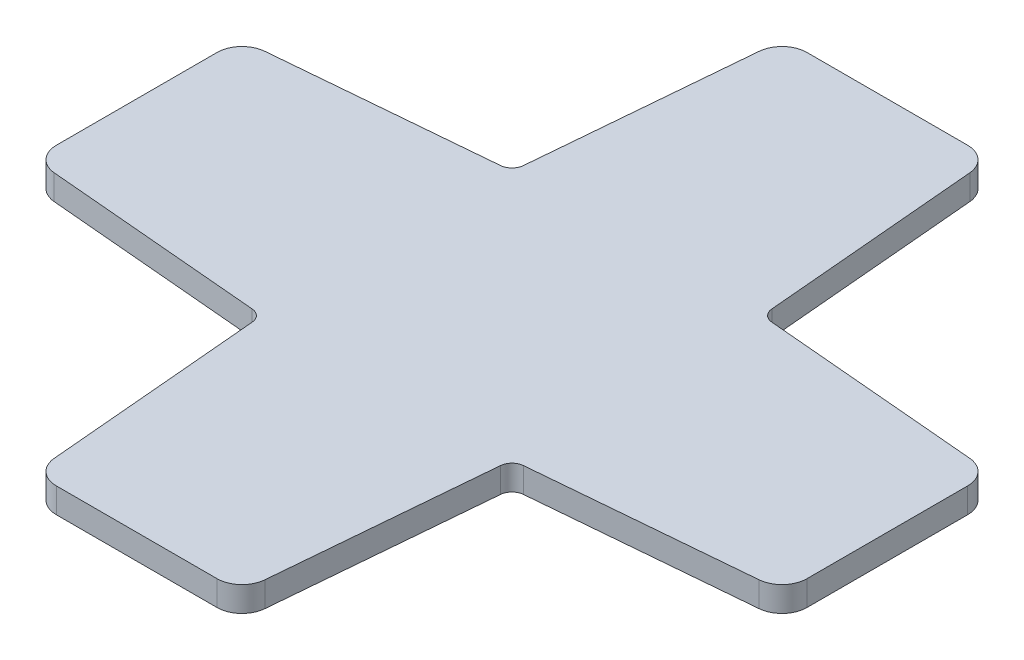
ISO-10303-21;
HEADER;
FILE_DESCRIPTION(('STEP AP214'),'2;1');
FILE_NAME('part.step','',(''),(''),'','','');
FILE_SCHEMA(('AUTOMOTIVE_DESIGN { 1 0 10303 214 1 1 1 1 }'));
ENDSEC;
DATA;
#1=APPLICATION_CONTEXT('core data for automotive mechanical design processes');
#2=APPLICATION_PROTOCOL_DEFINITION('international standard','automotive_design',2000,#1);
#3=PRODUCT_CONTEXT('',#1,'mechanical');
#4=PRODUCT('Part','Part','',(#3));
#5=PRODUCT_RELATED_PRODUCT_CATEGORY('part','',(#4));
#6=PRODUCT_DEFINITION_FORMATION('','',#4);
#7=PRODUCT_DEFINITION_CONTEXT('part definition',#1,'design');
#8=PRODUCT_DEFINITION('design','',#6,#7);
#9=PRODUCT_DEFINITION_SHAPE('','',#8);
#10=(LENGTH_UNIT() NAMED_UNIT(*) SI_UNIT(.MILLI.,.METRE.));
#11=(NAMED_UNIT(*) PLANE_ANGLE_UNIT() SI_UNIT($,.RADIAN.));
#12=(NAMED_UNIT(*) SI_UNIT($,.STERADIAN.) SOLID_ANGLE_UNIT());
#13=UNCERTAINTY_MEASURE_WITH_UNIT(LENGTH_MEASURE(1.E-05),#10,'distance_accuracy_value','');
#14=(GEOMETRIC_REPRESENTATION_CONTEXT(3) GLOBAL_UNCERTAINTY_ASSIGNED_CONTEXT((#13)) GLOBAL_UNIT_ASSIGNED_CONTEXT((#10,
#11,#12)) REPRESENTATION_CONTEXT('',''));
#15=CARTESIAN_POINT('',(0.,0.,0.));
#16=DIRECTION('',(0.,0.,1.));
#17=DIRECTION('',(1.,0.,0.));
#18=AXIS2_PLACEMENT_3D('',#15,#16,#17);
#19=CARTESIAN_POINT('',(9.6313750630421,3.,-42.));
#20=DIRECTION('',(0.,-1.,0.));
#21=DIRECTION('',(0.,0.,-1.));
#22=AXIS2_PLACEMENT_3D('',#19,#20,#21);
#23=CYLINDRICAL_SURFACE('',#22,3.);
#24=CARTESIAN_POINT('',(9.6313750630421,0.,-42.));
#25=DIRECTION('',(0.,1.,0.));
#26=DIRECTION('',(0.,0.,1.));
#27=AXIS2_PLACEMENT_3D('',#24,#25,#26);
#28=CIRCLE('',#27,3.);
#29=CARTESIAN_POINT('',(12.6200102180362,0.,-42.260882943738));
#30=VERTEX_POINT('',#29);
#31=CARTESIAN_POINT('',(9.63137506304208,0.,-45.));
#32=VERTEX_POINT('',#31);
#33=EDGE_CURVE('E225',#30,#32,#28,.T.);
#34=ORIENTED_EDGE('',*,*,#33,.T.);
#35=DIRECTION('',(0.,-1.,0.));
#36=VECTOR('',#35,1.);
#37=CARTESIAN_POINT('',(9.63137506304208,3.,-45.));
#38=LINE('',#37,#36);
#39=CARTESIAN_POINT('',(9.63137506304208,3.,-45.));
#40=VERTEX_POINT('',#39);
#41=EDGE_CURVE('E11',#40,#32,#38,.T.);
#42=ORIENTED_EDGE('',*,*,#41,.F.);
#43=CARTESIAN_POINT('',(9.6313750630421,3.,-42.));
#44=DIRECTION('',(0.,1.,0.));
#45=DIRECTION('',(0.,0.,1.));
#46=AXIS2_PLACEMENT_3D('',#43,#44,#45);
#47=CIRCLE('',#46,3.);
#48=CARTESIAN_POINT('',(12.6200102180362,3.,-42.260882943738));
#49=VERTEX_POINT('',#48);
#50=EDGE_CURVE('E271',#49,#40,#47,.T.);
#51=ORIENTED_EDGE('',*,*,#50,.F.);
#52=DIRECTION('',(0.,-1.,0.));
#53=VECTOR('',#52,1.);
#54=CARTESIAN_POINT('',(12.6200102180362,3.,-42.260882943738));
#55=LINE('',#54,#53);
#56=EDGE_CURVE('E221',#49,#30,#55,.T.);
#57=ORIENTED_EDGE('',*,*,#56,.T.);
#58=EDGE_LOOP('',(#34,#42,#51,#57));
#59=FACE_BOUND('',#58,.T.);
#60=ADVANCED_FACE('F33',(#59),#23,.T.);
#61=CARTESIAN_POINT('',(9.63137506304208,3.,-45.));
#62=DIRECTION('',(0.,0.,1.));
#63=DIRECTION('',(1.,0.,0.));
#64=AXIS2_PLACEMENT_3D('',#61,#62,#63);
#65=PLANE('',#64);
#66=DIRECTION('',(-1.,0.,0.));
#67=VECTOR('',#66,1.);
#68=CARTESIAN_POINT('',(9.63137506304208,0.,-45.));
#69=LINE('',#68,#67);
#70=CARTESIAN_POINT('',(-9.63137506304208,0.,-45.));
#71=VERTEX_POINT('',#70);
#72=EDGE_CURVE('E228',#32,#71,#69,.T.);
#73=ORIENTED_EDGE('',*,*,#72,.T.);
#74=DIRECTION('',(0.,-1.,0.));
#75=VECTOR('',#74,1.);
#76=CARTESIAN_POINT('',(-9.63137506304208,3.,-45.));
#77=LINE('',#76,#75);
#78=CARTESIAN_POINT('',(-9.63137506304208,3.,-45.));
#79=VERTEX_POINT('',#78);
#80=EDGE_CURVE('E41',#79,#71,#77,.T.);
#81=ORIENTED_EDGE('',*,*,#80,.F.);
#82=DIRECTION('',(-1.,0.,0.));
#83=VECTOR('',#82,1.);
#84=CARTESIAN_POINT('',(9.63137506304208,3.,-45.));
#85=LINE('',#84,#83);
#86=EDGE_CURVE('E140',#40,#79,#85,.T.);
#87=ORIENTED_EDGE('',*,*,#86,.F.);
#88=ORIENTED_EDGE('',*,*,#41,.T.);
#89=EDGE_LOOP('',(#73,#81,#87,#88));
#90=FACE_BOUND('',#89,.T.);
#91=ADVANCED_FACE('F409',(#90),#65,.F.);
#92=CARTESIAN_POINT('',(-9.6313750630421,3.,-42.));
#93=DIRECTION('',(0.,-1.,0.));
#94=DIRECTION('',(0.,0.,-1.));
#95=AXIS2_PLACEMENT_3D('',#92,#93,#94);
#96=CYLINDRICAL_SURFACE('',#95,3.);
#97=CARTESIAN_POINT('',(-9.6313750630421,0.,-42.));
#98=DIRECTION('',(0.,1.,0.));
#99=DIRECTION('',(0.,0.,-1.));
#100=AXIS2_PLACEMENT_3D('',#97,#98,#99);
#101=CIRCLE('',#100,3.);
#102=CARTESIAN_POINT('',(-12.6200102180362,0.,-42.260882943738));
#103=VERTEX_POINT('',#102);
#104=EDGE_CURVE('E230',#71,#103,#101,.T.);
#105=ORIENTED_EDGE('',*,*,#104,.T.);
#106=DIRECTION('',(0.,-1.,0.));
#107=VECTOR('',#106,1.);
#108=CARTESIAN_POINT('',(-12.6200102180362,3.,-42.260882943738));
#109=LINE('',#108,#107);
#110=CARTESIAN_POINT('',(-12.6200102180362,3.,-42.260882943738));
#111=VERTEX_POINT('',#110);
#112=EDGE_CURVE('E326',#111,#103,#109,.T.);
#113=ORIENTED_EDGE('',*,*,#112,.F.);
#114=CARTESIAN_POINT('',(-9.6313750630421,3.,-42.));
#115=DIRECTION('',(0.,1.,0.));
#116=DIRECTION('',(0.,0.,-1.));
#117=AXIS2_PLACEMENT_3D('',#114,#115,#116);
#118=CIRCLE('',#117,3.);
#119=EDGE_CURVE('E334',#79,#111,#118,.T.);
#120=ORIENTED_EDGE('',*,*,#119,.F.);
#121=ORIENTED_EDGE('',*,*,#80,.T.);
#122=EDGE_LOOP('',(#105,#113,#120,#121));
#123=FACE_BOUND('',#122,.T.);
#124=ADVANCED_FACE('F332',(#123),#96,.T.);
#125=CARTESIAN_POINT('',(-14.8901887165629,3.,-16.2540648221909));
#126=DIRECTION('',(0.996211718331365,0.,0.0869609812460085));
#127=DIRECTION('',(0.0869609812460086,0.,-0.996211718331365));
#128=AXIS2_PLACEMENT_3D('',#125,#126,#127);
#129=PLANE('',#128);
#130=DIRECTION('',(-0.0869609812460086,0.,0.996211718331365));
#131=VECTOR('',#130,1.);
#132=CARTESIAN_POINT('',(-14.8901887165629,0.,-16.2540648221909));
#133=LINE('',#132,#131);
#134=CARTESIAN_POINT('',(-14.8901887165629,0.,-16.2540648221909));
#135=VERTEX_POINT('',#134);
#136=EDGE_CURVE('E232',#103,#135,#133,.T.);
#137=ORIENTED_EDGE('',*,*,#136,.T.);
#138=DIRECTION('',(0.,-1.,0.));
#139=VECTOR('',#138,1.);
#140=CARTESIAN_POINT('',(-14.8901887165629,3.,-16.2540648221909));
#141=LINE('',#140,#139);
#142=CARTESIAN_POINT('',(-14.8901887165629,3.,-16.2540648221909));
#143=VERTEX_POINT('',#142);
#144=EDGE_CURVE('E323',#143,#135,#141,.T.);
#145=ORIENTED_EDGE('',*,*,#144,.F.);
#146=DIRECTION('',(-0.0869609812460086,0.,0.996211718331365));
#147=VECTOR('',#146,1.);
#148=CARTESIAN_POINT('',(-14.8901887165629,3.,-16.2540648221909));
#149=LINE('',#148,#147);
#150=EDGE_CURVE('E352',#111,#143,#149,.T.);
#151=ORIENTED_EDGE('',*,*,#150,.F.);
#152=ORIENTED_EDGE('',*,*,#112,.T.);
#153=EDGE_LOOP('',(#137,#145,#151,#152));
#154=FACE_BOUND('',#153,.T.);
#155=ADVANCED_FACE('F343',(#154),#129,.F.);
#156=CARTESIAN_POINT('',(-16.38450629406,3.,-16.3845062940599));
#157=DIRECTION('',(0.,-1.,0.));
#158=DIRECTION('',(0.,0.,-1.));
#159=AXIS2_PLACEMENT_3D('',#156,#157,#158);
#160=CYLINDRICAL_SURFACE('',#159,1.5);
#161=CARTESIAN_POINT('',(-16.38450629406,0.,-16.3845062940599));
#162=DIRECTION('',(0.,-1.,0.));
#163=DIRECTION('',(0.,0.,1.));
#164=AXIS2_PLACEMENT_3D('',#161,#162,#163);
#165=CIRCLE('',#164,1.5);
#166=CARTESIAN_POINT('',(-16.2540648221909,0.,-14.8901887165629));
#167=VERTEX_POINT('',#166);
#168=EDGE_CURVE('E234',#135,#167,#165,.T.);
#169=ORIENTED_EDGE('',*,*,#168,.T.);
#170=DIRECTION('',(0.,-1.,0.));
#171=VECTOR('',#170,1.);
#172=CARTESIAN_POINT('',(-16.2540648221909,3.,-14.8901887165629));
#173=LINE('',#172,#171);
#174=CARTESIAN_POINT('',(-16.2540648221909,3.,-14.8901887165629));
#175=VERTEX_POINT('',#174);
#176=EDGE_CURVE('E320',#175,#167,#173,.T.);
#177=ORIENTED_EDGE('',*,*,#176,.F.);
#178=CARTESIAN_POINT('',(-16.38450629406,3.,-16.3845062940599));
#179=DIRECTION('',(0.,-1.,0.));
#180=DIRECTION('',(0.,0.,1.));
#181=AXIS2_PLACEMENT_3D('',#178,#179,#180);
#182=CIRCLE('',#181,1.5);
#183=EDGE_CURVE('E349',#143,#175,#182,.T.);
#184=ORIENTED_EDGE('',*,*,#183,.F.);
#185=ORIENTED_EDGE('',*,*,#144,.T.);
#186=EDGE_LOOP('',(#169,#177,#184,#185));
#187=FACE_BOUND('',#186,.T.);
#188=ADVANCED_FACE('F347',(#187),#160,.F.);
#189=CARTESIAN_POINT('',(-16.2540648221909,3.,-14.8901887165629));
#190=DIRECTION('',(0.0869609812460074,0.,0.996211718331365));
#191=DIRECTION('',(0.996211718331365,0.,-0.0869609812460074));
#192=AXIS2_PLACEMENT_3D('',#189,#190,#191);
#193=PLANE('',#192);
#194=DIRECTION('',(-0.996211718331365,0.,0.0869609812460074));
#195=VECTOR('',#194,1.);
#196=CARTESIAN_POINT('',(-16.2540648221909,0.,-14.8901887165629));
#197=LINE('',#196,#195);
#198=CARTESIAN_POINT('',(-42.260882943738,0.,-12.6200102180362));
#199=VERTEX_POINT('',#198);
#200=EDGE_CURVE('E236',#167,#199,#197,.T.);
#201=ORIENTED_EDGE('',*,*,#200,.T.);
#202=DIRECTION('',(0.,-1.,0.));
#203=VECTOR('',#202,1.);
#204=CARTESIAN_POINT('',(-42.260882943738,3.,-12.6200102180362));
#205=LINE('',#204,#203);
#206=CARTESIAN_POINT('',(-42.260882943738,3.,-12.6200102180362));
#207=VERTEX_POINT('',#206);
#208=EDGE_CURVE('E317',#207,#199,#205,.T.);
#209=ORIENTED_EDGE('',*,*,#208,.F.);
#210=DIRECTION('',(-0.996211718331365,0.,0.0869609812460074));
#211=VECTOR('',#210,1.);
#212=CARTESIAN_POINT('',(-16.2540648221909,3.,-14.8901887165629));
#213=LINE('',#212,#211);
#214=EDGE_CURVE('E351',#175,#207,#213,.T.);
#215=ORIENTED_EDGE('',*,*,#214,.F.);
#216=ORIENTED_EDGE('',*,*,#176,.T.);
#217=EDGE_LOOP('',(#201,#209,#215,#216));
#218=FACE_BOUND('',#217,.T.);
#219=ADVANCED_FACE('F422',(#218),#193,.F.);
#220=CARTESIAN_POINT('',(-42.,3.,-9.63137506304211));
#221=DIRECTION('',(0.,-1.,0.));
#222=DIRECTION('',(0.,0.,-1.));
#223=AXIS2_PLACEMENT_3D('',#220,#221,#222);
#224=CYLINDRICAL_SURFACE('',#223,3.00000000000002);
#225=CARTESIAN_POINT('',(-42.,0.,-9.63137506304211));
#226=DIRECTION('',(0.,1.,0.));
#227=DIRECTION('',(0.,0.,1.));
#228=AXIS2_PLACEMENT_3D('',#225,#226,#227);
#229=CIRCLE('',#228,3.00000000000002);
#230=CARTESIAN_POINT('',(-45.,0.,-9.63137506304211));
#231=VERTEX_POINT('',#230);
#232=EDGE_CURVE('E238',#199,#231,#229,.T.);
#233=ORIENTED_EDGE('',*,*,#232,.T.);
#234=DIRECTION('',(0.,-1.,0.));
#235=VECTOR('',#234,1.);
#236=CARTESIAN_POINT('',(-45.,3.,-9.63137506304211));
#237=LINE('',#236,#235);
#238=CARTESIAN_POINT('',(-45.,3.,-9.63137506304211));
#239=VERTEX_POINT('',#238);
#240=EDGE_CURVE('E314',#239,#231,#237,.T.);
#241=ORIENTED_EDGE('',*,*,#240,.F.);
#242=CARTESIAN_POINT('',(-42.,3.,-9.63137506304211));
#243=DIRECTION('',(0.,1.,0.));
#244=DIRECTION('',(0.,0.,1.));
#245=AXIS2_PLACEMENT_3D('',#242,#243,#244);
#246=CIRCLE('',#245,3.00000000000002);
#247=EDGE_CURVE('E354',#207,#239,#246,.T.);
#248=ORIENTED_EDGE('',*,*,#247,.F.);
#249=ORIENTED_EDGE('',*,*,#208,.T.);
#250=EDGE_LOOP('',(#233,#241,#248,#249));
#251=FACE_BOUND('',#250,.T.);
#252=ADVANCED_FACE('F425',(#251),#224,.T.);
#253=CARTESIAN_POINT('',(-45.,3.,-9.63137506304211));
#254=DIRECTION('',(1.,0.,0.));
#255=DIRECTION('',(0.,0.,-1.));
#256=AXIS2_PLACEMENT_3D('',#253,#254,#255);
#257=PLANE('',#256);
#258=DIRECTION('',(0.,0.,1.));
#259=VECTOR('',#258,1.);
#260=CARTESIAN_POINT('',(-45.,0.,-9.63137506304211));
#261=LINE('',#260,#259);
#262=CARTESIAN_POINT('',(-45.,0.,9.63137506304212));
#263=VERTEX_POINT('',#262);
#264=EDGE_CURVE('E240',#231,#263,#261,.T.);
#265=ORIENTED_EDGE('',*,*,#264,.T.);
#266=DIRECTION('',(0.,-1.,0.));
#267=VECTOR('',#266,1.);
#268=CARTESIAN_POINT('',(-45.,3.,9.63137506304212));
#269=LINE('',#268,#267);
#270=CARTESIAN_POINT('',(-45.,3.,9.63137506304212));
#271=VERTEX_POINT('',#270);
#272=EDGE_CURVE('E311',#271,#263,#269,.T.);
#273=ORIENTED_EDGE('',*,*,#272,.F.);
#274=DIRECTION('',(0.,0.,1.));
#275=VECTOR('',#274,1.);
#276=CARTESIAN_POINT('',(-45.,3.,-9.63137506304211));
#277=LINE('',#276,#275);
#278=EDGE_CURVE('E360',#239,#271,#277,.T.);
#279=ORIENTED_EDGE('',*,*,#278,.F.);
#280=ORIENTED_EDGE('',*,*,#240,.T.);
#281=EDGE_LOOP('',(#265,#273,#279,#280));
#282=FACE_BOUND('',#281,.T.);
#283=ADVANCED_FACE('F429',(#282),#257,.F.);
#284=CARTESIAN_POINT('',(-42.,3.,9.63137506304212));
#285=DIRECTION('',(0.,-1.,0.));
#286=DIRECTION('',(0.,0.,-1.));
#287=AXIS2_PLACEMENT_3D('',#284,#285,#286);
#288=CYLINDRICAL_SURFACE('',#287,3.00000000000002);
#289=CARTESIAN_POINT('',(-42.,0.,9.63137506304212));
#290=DIRECTION('',(0.,1.,0.));
#291=DIRECTION('',(0.,0.,-1.));
#292=AXIS2_PLACEMENT_3D('',#289,#290,#291);
#293=CIRCLE('',#292,3.00000000000002);
#294=CARTESIAN_POINT('',(-42.260882943738,0.,12.6200102180362));
#295=VERTEX_POINT('',#294);
#296=EDGE_CURVE('E242',#263,#295,#293,.T.);
#297=ORIENTED_EDGE('',*,*,#296,.T.);
#298=DIRECTION('',(0.,-1.,0.));
#299=VECTOR('',#298,1.);
#300=CARTESIAN_POINT('',(-42.260882943738,3.,12.6200102180362));
#301=LINE('',#300,#299);
#302=CARTESIAN_POINT('',(-42.260882943738,3.,12.6200102180362));
#303=VERTEX_POINT('',#302);
#304=EDGE_CURVE('E308',#303,#295,#301,.T.);
#305=ORIENTED_EDGE('',*,*,#304,.F.);
#306=CARTESIAN_POINT('',(-42.,3.,9.63137506304212));
#307=DIRECTION('',(0.,1.,0.));
#308=DIRECTION('',(0.,0.,-1.));
#309=AXIS2_PLACEMENT_3D('',#306,#307,#308);
#310=CIRCLE('',#309,3.00000000000002);
#311=EDGE_CURVE('E362',#271,#303,#310,.T.);
#312=ORIENTED_EDGE('',*,*,#311,.F.);
#313=ORIENTED_EDGE('',*,*,#272,.T.);
#314=EDGE_LOOP('',(#297,#305,#312,#313));
#315=FACE_BOUND('',#314,.T.);
#316=ADVANCED_FACE('F433',(#315),#288,.T.);
#317=CARTESIAN_POINT('',(-16.254064822191,3.,14.8901887165629));
#318=DIRECTION('',(0.0869609812460067,0.,-0.996211718331365));
#319=DIRECTION('',(-0.996211718331365,0.,-0.0869609812460067));
#320=AXIS2_PLACEMENT_3D('',#317,#318,#319);
#321=PLANE('',#320);
#322=DIRECTION('',(0.996211718331365,0.,0.0869609812460067));
#323=VECTOR('',#322,1.);
#324=CARTESIAN_POINT('',(-16.254064822191,0.,14.8901887165629));
#325=LINE('',#324,#323);
#326=CARTESIAN_POINT('',(-16.254064822191,0.,14.8901887165629));
#327=VERTEX_POINT('',#326);
#328=EDGE_CURVE('E244',#295,#327,#325,.T.);
#329=ORIENTED_EDGE('',*,*,#328,.T.);
#330=DIRECTION('',(0.,-1.,0.));
#331=VECTOR('',#330,1.);
#332=CARTESIAN_POINT('',(-16.254064822191,3.,14.8901887165629));
#333=LINE('',#332,#331);
#334=CARTESIAN_POINT('',(-16.254064822191,3.,14.8901887165629));
#335=VERTEX_POINT('',#334);
#336=EDGE_CURVE('E305',#335,#327,#333,.T.);
#337=ORIENTED_EDGE('',*,*,#336,.F.);
#338=DIRECTION('',(0.996211718331365,0.,0.0869609812460067));
#339=VECTOR('',#338,1.);
#340=CARTESIAN_POINT('',(-16.254064822191,3.,14.8901887165629));
#341=LINE('',#340,#339);
#342=EDGE_CURVE('E364',#303,#335,#341,.T.);
#343=ORIENTED_EDGE('',*,*,#342,.F.);
#344=ORIENTED_EDGE('',*,*,#304,.T.);
#345=EDGE_LOOP('',(#329,#337,#343,#344));
#346=FACE_BOUND('',#345,.T.);
#347=ADVANCED_FACE('F437',(#346),#321,.F.);
#348=CARTESIAN_POINT('',(-16.38450629406,3.,16.3845062940599));
#349=DIRECTION('',(0.,-1.,0.));
#350=DIRECTION('',(0.,0.,-1.));
#351=AXIS2_PLACEMENT_3D('',#348,#349,#350);
#352=CYLINDRICAL_SURFACE('',#351,1.5);
#353=CARTESIAN_POINT('',(-16.38450629406,0.,16.3845062940599));
#354=DIRECTION('',(0.,-1.,0.));
#355=DIRECTION('',(0.,0.,1.));
#356=AXIS2_PLACEMENT_3D('',#353,#354,#355);
#357=CIRCLE('',#356,1.5);
#358=CARTESIAN_POINT('',(-14.8901887165629,0.,16.2540648221909));
#359=VERTEX_POINT('',#358);
#360=EDGE_CURVE('E246',#327,#359,#357,.T.);
#361=ORIENTED_EDGE('',*,*,#360,.T.);
#362=DIRECTION('',(0.,-1.,0.));
#363=VECTOR('',#362,1.);
#364=CARTESIAN_POINT('',(-14.8901887165629,3.,16.2540648221909));
#365=LINE('',#364,#363);
#366=CARTESIAN_POINT('',(-14.8901887165629,3.,16.2540648221909));
#367=VERTEX_POINT('',#366);
#368=EDGE_CURVE('E302',#367,#359,#365,.T.);
#369=ORIENTED_EDGE('',*,*,#368,.F.);
#370=CARTESIAN_POINT('',(-16.38450629406,3.,16.3845062940599));
#371=DIRECTION('',(0.,-1.,0.));
#372=DIRECTION('',(0.,0.,1.));
#373=AXIS2_PLACEMENT_3D('',#370,#371,#372);
#374=CIRCLE('',#373,1.5);
#375=EDGE_CURVE('E366',#335,#367,#374,.T.);
#376=ORIENTED_EDGE('',*,*,#375,.F.);
#377=ORIENTED_EDGE('',*,*,#336,.T.);
#378=EDGE_LOOP('',(#361,#369,#376,#377));
#379=FACE_BOUND('',#378,.T.);
#380=ADVANCED_FACE('F441',(#379),#352,.F.);
#381=CARTESIAN_POINT('',(-14.8901887165629,3.,16.2540648221909));
#382=DIRECTION('',(0.996211718331365,0.,-0.0869609812460083));
#383=DIRECTION('',(-0.0869609812460083,0.,-0.996211718331365));
#384=AXIS2_PLACEMENT_3D('',#381,#382,#383);
#385=PLANE('',#384);
#386=DIRECTION('',(0.0869609812460083,0.,0.996211718331365));
#387=VECTOR('',#386,1.);
#388=CARTESIAN_POINT('',(-14.8901887165629,0.,16.2540648221909));
#389=LINE('',#388,#387);
#390=CARTESIAN_POINT('',(-12.6200102180362,0.,42.260882943738));
#391=VERTEX_POINT('',#390);
#392=EDGE_CURVE('E248',#359,#391,#389,.T.);
#393=ORIENTED_EDGE('',*,*,#392,.T.);
#394=DIRECTION('',(0.,-1.,0.));
#395=VECTOR('',#394,1.);
#396=CARTESIAN_POINT('',(-12.6200102180362,3.,42.260882943738));
#397=LINE('',#396,#395);
#398=CARTESIAN_POINT('',(-12.6200102180362,3.,42.260882943738));
#399=VERTEX_POINT('',#398);
#400=EDGE_CURVE('E299',#399,#391,#397,.T.);
#401=ORIENTED_EDGE('',*,*,#400,.F.);
#402=DIRECTION('',(0.0869609812460083,0.,0.996211718331365));
#403=VECTOR('',#402,1.);
#404=CARTESIAN_POINT('',(-14.8901887165629,3.,16.2540648221909));
#405=LINE('',#404,#403);
#406=EDGE_CURVE('E368',#367,#399,#405,.T.);
#407=ORIENTED_EDGE('',*,*,#406,.F.);
#408=ORIENTED_EDGE('',*,*,#368,.T.);
#409=EDGE_LOOP('',(#393,#401,#407,#408));
#410=FACE_BOUND('',#409,.T.);
#411=ADVANCED_FACE('F445',(#410),#385,.F.);
#412=CARTESIAN_POINT('',(-9.63137506304211,3.,42.));
#413=DIRECTION('',(0.,-1.,0.));
#414=DIRECTION('',(0.,0.,-1.));
#415=AXIS2_PLACEMENT_3D('',#412,#413,#414);
#416=CYLINDRICAL_SURFACE('',#415,3.);
#417=CARTESIAN_POINT('',(-9.63137506304211,0.,42.));
#418=DIRECTION('',(0.,1.,0.));
#419=DIRECTION('',(0.,0.,1.));
#420=AXIS2_PLACEMENT_3D('',#417,#418,#419);
#421=CIRCLE('',#420,3.);
#422=CARTESIAN_POINT('',(-9.63137506304209,0.,45.));
#423=VERTEX_POINT('',#422);
#424=EDGE_CURVE('E250',#391,#423,#421,.T.);
#425=ORIENTED_EDGE('',*,*,#424,.T.);
#426=DIRECTION('',(0.,-1.,0.));
#427=VECTOR('',#426,1.);
#428=CARTESIAN_POINT('',(-9.63137506304209,3.,45.));
#429=LINE('',#428,#427);
#430=CARTESIAN_POINT('',(-9.63137506304209,3.,45.));
#431=VERTEX_POINT('',#430);
#432=EDGE_CURVE('E296',#431,#423,#429,.T.);
#433=ORIENTED_EDGE('',*,*,#432,.F.);
#434=CARTESIAN_POINT('',(-9.63137506304211,3.,42.));
#435=DIRECTION('',(0.,1.,0.));
#436=DIRECTION('',(0.,0.,1.));
#437=AXIS2_PLACEMENT_3D('',#434,#435,#436);
#438=CIRCLE('',#437,3.);
#439=EDGE_CURVE('E370',#399,#431,#438,.T.);
#440=ORIENTED_EDGE('',*,*,#439,.F.);
#441=ORIENTED_EDGE('',*,*,#400,.T.);
#442=EDGE_LOOP('',(#425,#433,#440,#441));
#443=FACE_BOUND('',#442,.T.);
#444=ADVANCED_FACE('F449',(#443),#416,.T.);
#445=CARTESIAN_POINT('',(9.63137506304206,3.,45.));
#446=DIRECTION('',(0.,0.,-1.));
#447=DIRECTION('',(-1.,0.,0.));
#448=AXIS2_PLACEMENT_3D('',#445,#446,#447);
#449=PLANE('',#448);
#450=DIRECTION('',(1.,0.,0.));
#451=VECTOR('',#450,1.);
#452=CARTESIAN_POINT('',(9.63137506304206,0.,45.));
#453=LINE('',#452,#451);
#454=CARTESIAN_POINT('',(9.63137506304206,0.,45.));
#455=VERTEX_POINT('',#454);
#456=EDGE_CURVE('E252',#423,#455,#453,.T.);
#457=ORIENTED_EDGE('',*,*,#456,.T.);
#458=DIRECTION('',(0.,-1.,0.));
#459=VECTOR('',#458,1.);
#460=CARTESIAN_POINT('',(9.63137506304206,3.,45.));
#461=LINE('',#460,#459);
#462=CARTESIAN_POINT('',(9.63137506304206,3.,45.));
#463=VERTEX_POINT('',#462);
#464=EDGE_CURVE('E293',#463,#455,#461,.T.);
#465=ORIENTED_EDGE('',*,*,#464,.F.);
#466=DIRECTION('',(1.,0.,0.));
#467=VECTOR('',#466,1.);
#468=CARTESIAN_POINT('',(9.63137506304206,3.,45.));
#469=LINE('',#468,#467);
#470=EDGE_CURVE('E372',#431,#463,#469,.T.);
#471=ORIENTED_EDGE('',*,*,#470,.F.);
#472=ORIENTED_EDGE('',*,*,#432,.T.);
#473=EDGE_LOOP('',(#457,#465,#471,#472));
#474=FACE_BOUND('',#473,.T.);
#475=ADVANCED_FACE('F453',(#474),#449,.F.);
#476=CARTESIAN_POINT('',(9.63137506304209,3.,42.));
#477=DIRECTION('',(0.,-1.,0.));
#478=DIRECTION('',(0.,0.,-1.));
#479=AXIS2_PLACEMENT_3D('',#476,#477,#478);
#480=CYLINDRICAL_SURFACE('',#479,3.);
#481=CARTESIAN_POINT('',(9.63137506304209,0.,42.));
#482=DIRECTION('',(0.,1.,0.));
#483=DIRECTION('',(0.,0.,-1.));
#484=AXIS2_PLACEMENT_3D('',#481,#482,#483);
#485=CIRCLE('',#484,3.);
#486=CARTESIAN_POINT('',(12.6200102180362,0.,42.260882943738));
#487=VERTEX_POINT('',#486);
#488=EDGE_CURVE('E254',#455,#487,#485,.T.);
#489=ORIENTED_EDGE('',*,*,#488,.T.);
#490=DIRECTION('',(0.,-1.,0.));
#491=VECTOR('',#490,1.);
#492=CARTESIAN_POINT('',(12.6200102180362,3.,42.260882943738));
#493=LINE('',#492,#491);
#494=CARTESIAN_POINT('',(12.6200102180362,3.,42.260882943738));
#495=VERTEX_POINT('',#494);
#496=EDGE_CURVE('E290',#495,#487,#493,.T.);
#497=ORIENTED_EDGE('',*,*,#496,.F.);
#498=CARTESIAN_POINT('',(9.63137506304209,3.,42.));
#499=DIRECTION('',(0.,1.,0.));
#500=DIRECTION('',(0.,0.,-1.));
#501=AXIS2_PLACEMENT_3D('',#498,#499,#500);
#502=CIRCLE('',#501,3.);
#503=EDGE_CURVE('E374',#463,#495,#502,.T.);
#504=ORIENTED_EDGE('',*,*,#503,.F.);
#505=ORIENTED_EDGE('',*,*,#464,.T.);
#506=EDGE_LOOP('',(#489,#497,#504,#505));
#507=FACE_BOUND('',#506,.T.);
#508=ADVANCED_FACE('F457',(#507),#480,.T.);
#509=CARTESIAN_POINT('',(14.8901887165629,3.,16.2540648221909));
#510=DIRECTION('',(-0.996211718331365,0.,-0.0869609812460081));
#511=DIRECTION('',(-0.0869609812460081,0.,0.996211718331365));
#512=AXIS2_PLACEMENT_3D('',#509,#510,#511);
#513=PLANE('',#512);
#514=DIRECTION('',(0.0869609812460081,0.,-0.996211718331365));
#515=VECTOR('',#514,1.);
#516=CARTESIAN_POINT('',(14.8901887165629,0.,16.2540648221909));
#517=LINE('',#516,#515);
#518=CARTESIAN_POINT('',(14.8901887165629,0.,16.2540648221909));
#519=VERTEX_POINT('',#518);
#520=EDGE_CURVE('E256',#487,#519,#517,.T.);
#521=ORIENTED_EDGE('',*,*,#520,.T.);
#522=DIRECTION('',(0.,-1.,0.));
#523=VECTOR('',#522,1.);
#524=CARTESIAN_POINT('',(14.8901887165629,3.,16.2540648221909));
#525=LINE('',#524,#523);
#526=CARTESIAN_POINT('',(14.8901887165629,3.,16.2540648221909));
#527=VERTEX_POINT('',#526);
#528=EDGE_CURVE('E287',#527,#519,#525,.T.);
#529=ORIENTED_EDGE('',*,*,#528,.F.);
#530=DIRECTION('',(0.0869609812460081,0.,-0.996211718331365));
#531=VECTOR('',#530,1.);
#532=CARTESIAN_POINT('',(14.8901887165629,3.,16.2540648221909));
#533=LINE('',#532,#531);
#534=EDGE_CURVE('E376',#495,#527,#533,.T.);
#535=ORIENTED_EDGE('',*,*,#534,.F.);
#536=ORIENTED_EDGE('',*,*,#496,.T.);
#537=EDGE_LOOP('',(#521,#529,#535,#536));
#538=FACE_BOUND('',#537,.T.);
#539=ADVANCED_FACE('F461',(#538),#513,.F.);
#540=CARTESIAN_POINT('',(16.3845062940599,3.,16.3845062940599));
#541=DIRECTION('',(0.,-1.,0.));
#542=DIRECTION('',(0.,0.,-1.));
#543=AXIS2_PLACEMENT_3D('',#540,#541,#542);
#544=CYLINDRICAL_SURFACE('',#543,1.5);
#545=CARTESIAN_POINT('',(16.3845062940599,0.,16.3845062940599));
#546=DIRECTION('',(0.,-1.,0.));
#547=DIRECTION('',(0.,0.,1.));
#548=AXIS2_PLACEMENT_3D('',#545,#546,#547);
#549=CIRCLE('',#548,1.5);
#550=CARTESIAN_POINT('',(16.2540648221909,0.,14.8901887165629));
#551=VERTEX_POINT('',#550);
#552=EDGE_CURVE('E258',#519,#551,#549,.T.);
#553=ORIENTED_EDGE('',*,*,#552,.T.);
#554=DIRECTION('',(0.,-1.,0.));
#555=VECTOR('',#554,1.);
#556=CARTESIAN_POINT('',(16.2540648221909,3.,14.8901887165629));
#557=LINE('',#556,#555);
#558=CARTESIAN_POINT('',(16.2540648221909,3.,14.8901887165629));
#559=VERTEX_POINT('',#558);
#560=EDGE_CURVE('E284',#559,#551,#557,.T.);
#561=ORIENTED_EDGE('',*,*,#560,.F.);
#562=CARTESIAN_POINT('',(16.3845062940599,3.,16.3845062940599));
#563=DIRECTION('',(0.,-1.,0.));
#564=DIRECTION('',(0.,0.,1.));
#565=AXIS2_PLACEMENT_3D('',#562,#563,#564);
#566=CIRCLE('',#565,1.5);
#567=EDGE_CURVE('E378',#527,#559,#566,.T.);
#568=ORIENTED_EDGE('',*,*,#567,.F.);
#569=ORIENTED_EDGE('',*,*,#528,.T.);
#570=EDGE_LOOP('',(#553,#561,#568,#569));
#571=FACE_BOUND('',#570,.T.);
#572=ADVANCED_FACE('F465',(#571),#544,.F.);
#573=CARTESIAN_POINT('',(16.2540648221909,3.,14.8901887165629));
#574=DIRECTION('',(-0.0869609812460083,0.,-0.996211718331365));
#575=DIRECTION('',(-0.996211718331365,0.,0.0869609812460083));
#576=AXIS2_PLACEMENT_3D('',#573,#574,#575);
#577=PLANE('',#576);
#578=DIRECTION('',(0.996211718331365,0.,-0.0869609812460083));
#579=VECTOR('',#578,1.);
#580=CARTESIAN_POINT('',(16.2540648221909,0.,14.8901887165629));
#581=LINE('',#580,#579);
#582=CARTESIAN_POINT('',(42.260882943738,0.,12.6200102180362));
#583=VERTEX_POINT('',#582);
#584=EDGE_CURVE('E260',#551,#583,#581,.T.);
#585=ORIENTED_EDGE('',*,*,#584,.T.);
#586=DIRECTION('',(0.,-1.,0.));
#587=VECTOR('',#586,1.);
#588=CARTESIAN_POINT('',(42.260882943738,3.,12.6200102180362));
#589=LINE('',#588,#587);
#590=CARTESIAN_POINT('',(42.260882943738,3.,12.6200102180362));
#591=VERTEX_POINT('',#590);
#592=EDGE_CURVE('E281',#591,#583,#589,.T.);
#593=ORIENTED_EDGE('',*,*,#592,.F.);
#594=DIRECTION('',(0.996211718331365,0.,-0.0869609812460083));
#595=VECTOR('',#594,1.);
#596=CARTESIAN_POINT('',(16.2540648221909,3.,14.8901887165629));
#597=LINE('',#596,#595);
#598=EDGE_CURVE('E380',#559,#591,#597,.T.);
#599=ORIENTED_EDGE('',*,*,#598,.F.);
#600=ORIENTED_EDGE('',*,*,#560,.T.);
#601=EDGE_LOOP('',(#585,#593,#599,#600));
#602=FACE_BOUND('',#601,.T.);
#603=ADVANCED_FACE('F469',(#602),#577,.F.);
#604=CARTESIAN_POINT('',(42.,3.,9.63137506304208));
#605=DIRECTION('',(0.,-1.,0.));
#606=DIRECTION('',(0.,0.,-1.));
#607=AXIS2_PLACEMENT_3D('',#604,#605,#606);
#608=CYLINDRICAL_SURFACE('',#607,2.99999999999999);
#609=CARTESIAN_POINT('',(42.,0.,9.63137506304208));
#610=DIRECTION('',(0.,1.,0.));
#611=DIRECTION('',(0.,0.,1.));
#612=AXIS2_PLACEMENT_3D('',#609,#610,#611);
#613=CIRCLE('',#612,2.99999999999999);
#614=CARTESIAN_POINT('',(45.,0.,9.63137506304206));
#615=VERTEX_POINT('',#614);
#616=EDGE_CURVE('E262',#583,#615,#613,.T.);
#617=ORIENTED_EDGE('',*,*,#616,.T.);
#618=DIRECTION('',(0.,-1.,0.));
#619=VECTOR('',#618,1.);
#620=CARTESIAN_POINT('',(45.,3.,9.63137506304206));
#621=LINE('',#620,#619);
#622=CARTESIAN_POINT('',(45.,3.,9.63137506304206));
#623=VERTEX_POINT('',#622);
#624=EDGE_CURVE('E278',#623,#615,#621,.T.);
#625=ORIENTED_EDGE('',*,*,#624,.F.);
#626=CARTESIAN_POINT('',(42.,3.,9.63137506304208));
#627=DIRECTION('',(0.,1.,0.));
#628=DIRECTION('',(0.,0.,1.));
#629=AXIS2_PLACEMENT_3D('',#626,#627,#628);
#630=CIRCLE('',#629,2.99999999999999);
#631=EDGE_CURVE('E382',#591,#623,#630,.T.);
#632=ORIENTED_EDGE('',*,*,#631,.F.);
#633=ORIENTED_EDGE('',*,*,#592,.T.);
#634=EDGE_LOOP('',(#617,#625,#632,#633));
#635=FACE_BOUND('',#634,.T.);
#636=ADVANCED_FACE('F473',(#635),#608,.T.);
#637=CARTESIAN_POINT('',(45.,3.,-9.63137506304207));
#638=DIRECTION('',(-1.,0.,0.));
#639=DIRECTION('',(0.,0.,1.));
#640=AXIS2_PLACEMENT_3D('',#637,#638,#639);
#641=PLANE('',#640);
#642=DIRECTION('',(0.,0.,-1.));
#643=VECTOR('',#642,1.);
#644=CARTESIAN_POINT('',(45.,0.,-9.63137506304207));
#645=LINE('',#644,#643);
#646=CARTESIAN_POINT('',(45.,0.,-9.63137506304207));
#647=VERTEX_POINT('',#646);
#648=EDGE_CURVE('E264',#615,#647,#645,.T.);
#649=ORIENTED_EDGE('',*,*,#648,.T.);
#650=DIRECTION('',(0.,-1.,0.));
#651=VECTOR('',#650,1.);
#652=CARTESIAN_POINT('',(45.,3.,-9.63137506304207));
#653=LINE('',#652,#651);
#654=CARTESIAN_POINT('',(45.,3.,-9.63137506304207));
#655=VERTEX_POINT('',#654);
#656=EDGE_CURVE('E275',#655,#647,#653,.T.);
#657=ORIENTED_EDGE('',*,*,#656,.F.);
#658=DIRECTION('',(0.,0.,-1.));
#659=VECTOR('',#658,1.);
#660=CARTESIAN_POINT('',(45.,3.,-9.63137506304207));
#661=LINE('',#660,#659);
#662=EDGE_CURVE('E384',#623,#655,#661,.T.);
#663=ORIENTED_EDGE('',*,*,#662,.F.);
#664=ORIENTED_EDGE('',*,*,#624,.T.);
#665=EDGE_LOOP('',(#649,#657,#663,#664));
#666=FACE_BOUND('',#665,.T.);
#667=ADVANCED_FACE('F390',(#666),#641,.F.);
#668=CARTESIAN_POINT('',(42.,3.,-9.63137506304209));
#669=DIRECTION('',(0.,-1.,0.));
#670=DIRECTION('',(0.,0.,-1.));
#671=AXIS2_PLACEMENT_3D('',#668,#669,#670);
#672=CYLINDRICAL_SURFACE('',#671,3.);
#673=CARTESIAN_POINT('',(42.,0.,-9.63137506304209));
#674=DIRECTION('',(0.,1.,0.));
#675=DIRECTION('',(0.,0.,-1.));
#676=AXIS2_PLACEMENT_3D('',#673,#674,#675);
#677=CIRCLE('',#676,3.);
#678=CARTESIAN_POINT('',(42.260882943738,0.,-12.6200102180362));
#679=VERTEX_POINT('',#678);
#680=EDGE_CURVE('E266',#647,#679,#677,.T.);
#681=ORIENTED_EDGE('',*,*,#680,.T.);
#682=DIRECTION('',(0.,-1.,0.));
#683=VECTOR('',#682,1.);
#684=CARTESIAN_POINT('',(42.260882943738,3.,-12.6200102180362));
#685=LINE('',#684,#683);
#686=CARTESIAN_POINT('',(42.260882943738,3.,-12.6200102180362));
#687=VERTEX_POINT('',#686);
#688=EDGE_CURVE('E216',#687,#679,#685,.T.);
#689=ORIENTED_EDGE('',*,*,#688,.F.);
#690=CARTESIAN_POINT('',(42.,3.,-9.63137506304209));
#691=DIRECTION('',(0.,1.,0.));
#692=DIRECTION('',(0.,0.,-1.));
#693=AXIS2_PLACEMENT_3D('',#690,#691,#692);
#694=CIRCLE('',#693,3.);
#695=EDGE_CURVE('E207',#655,#687,#694,.T.);
#696=ORIENTED_EDGE('',*,*,#695,.F.);
#697=ORIENTED_EDGE('',*,*,#656,.T.);
#698=EDGE_LOOP('',(#681,#689,#696,#697));
#699=FACE_BOUND('',#698,.T.);
#700=ADVANCED_FACE('F394',(#699),#672,.T.);
#701=CARTESIAN_POINT('',(16.2540648221909,3.,-14.8901887165629));
#702=DIRECTION('',(-0.0869609812460081,0.,0.996211718331365));
#703=DIRECTION('',(0.996211718331365,0.,0.0869609812460081));
#704=AXIS2_PLACEMENT_3D('',#701,#702,#703);
#705=PLANE('',#704);
#706=DIRECTION('',(-0.996211718331365,0.,-0.0869609812460081));
#707=VECTOR('',#706,1.);
#708=CARTESIAN_POINT('',(16.2540648221909,0.,-14.8901887165629));
#709=LINE('',#708,#707);
#710=CARTESIAN_POINT('',(16.2540648221909,0.,-14.8901887165629));
#711=VERTEX_POINT('',#710);
#712=EDGE_CURVE('E215',#679,#711,#709,.T.);
#713=ORIENTED_EDGE('',*,*,#712,.T.);
#714=DIRECTION('',(0.,-1.,0.));
#715=VECTOR('',#714,1.);
#716=CARTESIAN_POINT('',(16.2540648221909,3.,-14.8901887165629));
#717=LINE('',#716,#715);
#718=CARTESIAN_POINT('',(16.2540648221909,3.,-14.8901887165629));
#719=VERTEX_POINT('',#718);
#720=EDGE_CURVE('E212',#719,#711,#717,.T.);
#721=ORIENTED_EDGE('',*,*,#720,.F.);
#722=DIRECTION('',(-0.996211718331365,0.,-0.0869609812460081));
#723=VECTOR('',#722,1.);
#724=CARTESIAN_POINT('',(16.2540648221909,3.,-14.8901887165629));
#725=LINE('',#724,#723);
#726=EDGE_CURVE('E201',#687,#719,#725,.T.);
#727=ORIENTED_EDGE('',*,*,#726,.F.);
#728=ORIENTED_EDGE('',*,*,#688,.T.);
#729=EDGE_LOOP('',(#713,#721,#727,#728));
#730=FACE_BOUND('',#729,.T.);
#731=ADVANCED_FACE('F213',(#730),#705,.F.);
#732=CARTESIAN_POINT('',(16.3845062940599,3.,-16.3845062940599));
#733=DIRECTION('',(0.,-1.,0.));
#734=DIRECTION('',(0.,0.,-1.));
#735=AXIS2_PLACEMENT_3D('',#732,#733,#734);
#736=CYLINDRICAL_SURFACE('',#735,1.5);
#737=CARTESIAN_POINT('',(16.3845062940599,0.,-16.3845062940599));
#738=DIRECTION('',(0.,-1.,0.));
#739=DIRECTION('',(0.,0.,1.));
#740=AXIS2_PLACEMENT_3D('',#737,#738,#739);
#741=CIRCLE('',#740,1.5);
#742=CARTESIAN_POINT('',(14.8901887165629,0.,-16.2540648221909));
#743=VERTEX_POINT('',#742);
#744=EDGE_CURVE('E126',#711,#743,#741,.T.);
#745=ORIENTED_EDGE('',*,*,#744,.T.);
#746=DIRECTION('',(0.,-1.,0.));
#747=VECTOR('',#746,1.);
#748=CARTESIAN_POINT('',(14.8901887165629,3.,-16.2540648221909));
#749=LINE('',#748,#747);
#750=CARTESIAN_POINT('',(14.8901887165629,3.,-16.2540648221909));
#751=VERTEX_POINT('',#750);
#752=EDGE_CURVE('E217',#751,#743,#749,.T.);
#753=ORIENTED_EDGE('',*,*,#752,.F.);
#754=CARTESIAN_POINT('',(16.3845062940599,3.,-16.3845062940599));
#755=DIRECTION('',(0.,-1.,0.));
#756=DIRECTION('',(0.,0.,1.));
#757=AXIS2_PLACEMENT_3D('',#754,#755,#756);
#758=CIRCLE('',#757,1.5);
#759=EDGE_CURVE('E205',#719,#751,#758,.T.);
#760=ORIENTED_EDGE('',*,*,#759,.F.);
#761=ORIENTED_EDGE('',*,*,#720,.T.);
#762=EDGE_LOOP('',(#745,#753,#760,#761));
#763=FACE_BOUND('',#762,.T.);
#764=ADVANCED_FACE('F219',(#763),#736,.F.);
#765=CARTESIAN_POINT('',(14.8901887165629,3.,-16.2540648221909));
#766=DIRECTION('',(-0.996211718331365,0.,0.0869609812460086));
#767=DIRECTION('',(0.0869609812460086,0.,0.996211718331365));
#768=AXIS2_PLACEMENT_3D('',#765,#766,#767);
#769=PLANE('',#768);
#770=DIRECTION('',(-0.0869609812460086,0.,-0.996211718331365));
#771=VECTOR('',#770,1.);
#772=CARTESIAN_POINT('',(14.8901887165629,0.,-16.2540648221909));
#773=LINE('',#772,#771);
#774=EDGE_CURVE('E132',#743,#30,#773,.T.);
#775=ORIENTED_EDGE('',*,*,#774,.T.);
#776=ORIENTED_EDGE('',*,*,#56,.F.);
#777=DIRECTION('',(-0.0869609812460086,0.,-0.996211718331365));
#778=VECTOR('',#777,1.);
#779=CARTESIAN_POINT('',(14.8901887165629,3.,-16.2540648221909));
#780=LINE('',#779,#778);
#781=EDGE_CURVE('E49',#751,#49,#780,.T.);
#782=ORIENTED_EDGE('',*,*,#781,.F.);
#783=ORIENTED_EDGE('',*,*,#752,.T.);
#784=EDGE_LOOP('',(#775,#776,#782,#783));
#785=FACE_BOUND('',#784,.T.);
#786=ADVANCED_FACE('F398',(#785),#769,.F.);
#787=CARTESIAN_POINT('',(9.6313750630421,3.,-42.));
#788=DIRECTION('',(0.,1.,0.));
#789=DIRECTION('',(0.,0.,1.));
#790=AXIS2_PLACEMENT_3D('',#787,#788,#789);
#791=PLANE('',#790);
#792=ORIENTED_EDGE('',*,*,#50,.T.);
#793=ORIENTED_EDGE('',*,*,#86,.T.);
#794=ORIENTED_EDGE('',*,*,#119,.T.);
#795=ORIENTED_EDGE('',*,*,#150,.T.);
#796=ORIENTED_EDGE('',*,*,#183,.T.);
#797=ORIENTED_EDGE('',*,*,#214,.T.);
#798=ORIENTED_EDGE('',*,*,#247,.T.);
#799=ORIENTED_EDGE('',*,*,#278,.T.);
#800=ORIENTED_EDGE('',*,*,#311,.T.);
#801=ORIENTED_EDGE('',*,*,#342,.T.);
#802=ORIENTED_EDGE('',*,*,#375,.T.);
#803=ORIENTED_EDGE('',*,*,#406,.T.);
#804=ORIENTED_EDGE('',*,*,#439,.T.);
#805=ORIENTED_EDGE('',*,*,#470,.T.);
#806=ORIENTED_EDGE('',*,*,#503,.T.);
#807=ORIENTED_EDGE('',*,*,#534,.T.);
#808=ORIENTED_EDGE('',*,*,#567,.T.);
#809=ORIENTED_EDGE('',*,*,#598,.T.);
#810=ORIENTED_EDGE('',*,*,#631,.T.);
#811=ORIENTED_EDGE('',*,*,#662,.T.);
#812=ORIENTED_EDGE('',*,*,#695,.T.);
#813=ORIENTED_EDGE('',*,*,#726,.T.);
#814=ORIENTED_EDGE('',*,*,#759,.T.);
#815=ORIENTED_EDGE('',*,*,#781,.T.);
#816=EDGE_LOOP('',(#792,#793,#794,#795,#796,#797,#798,#799,#800,#801,#802,#803,#804,#805,#806,
#807,#808,#809,#810,#811,#812,#813,#814,#815));
#817=FACE_BOUND('',#816,.T.);
#818=ADVANCED_FACE('F203',(#817),#791,.T.);
#819=CARTESIAN_POINT('',(9.6313750630421,0.,-42.));
#820=DIRECTION('',(0.,1.,0.));
#821=DIRECTION('',(0.,0.,1.));
#822=AXIS2_PLACEMENT_3D('',#819,#820,#821);
#823=PLANE('',#822);
#824=ORIENTED_EDGE('',*,*,#33,.F.);
#825=ORIENTED_EDGE('',*,*,#774,.F.);
#826=ORIENTED_EDGE('',*,*,#744,.F.);
#827=ORIENTED_EDGE('',*,*,#712,.F.);
#828=ORIENTED_EDGE('',*,*,#680,.F.);
#829=ORIENTED_EDGE('',*,*,#648,.F.);
#830=ORIENTED_EDGE('',*,*,#616,.F.);
#831=ORIENTED_EDGE('',*,*,#584,.F.);
#832=ORIENTED_EDGE('',*,*,#552,.F.);
#833=ORIENTED_EDGE('',*,*,#520,.F.);
#834=ORIENTED_EDGE('',*,*,#488,.F.);
#835=ORIENTED_EDGE('',*,*,#456,.F.);
#836=ORIENTED_EDGE('',*,*,#424,.F.);
#837=ORIENTED_EDGE('',*,*,#392,.F.);
#838=ORIENTED_EDGE('',*,*,#360,.F.);
#839=ORIENTED_EDGE('',*,*,#328,.F.);
#840=ORIENTED_EDGE('',*,*,#296,.F.);
#841=ORIENTED_EDGE('',*,*,#264,.F.);
#842=ORIENTED_EDGE('',*,*,#232,.F.);
#843=ORIENTED_EDGE('',*,*,#200,.F.);
#844=ORIENTED_EDGE('',*,*,#168,.F.);
#845=ORIENTED_EDGE('',*,*,#136,.F.);
#846=ORIENTED_EDGE('',*,*,#104,.F.);
#847=ORIENTED_EDGE('',*,*,#72,.F.);
#848=EDGE_LOOP('',(#824,#825,#826,#827,#828,#829,#830,#831,#832,#833,#834,#835,#836,#837,#838,
#839,#840,#841,#842,#843,#844,#845,#846,#847));
#849=FACE_BOUND('',#848,.T.);
#850=ADVANCED_FACE('F338',(#849),#823,.F.);
#851=CLOSED_SHELL('',(#60,#91,#124,#155,#188,#219,#252,#283,#316,#347,#380,#411,#444,#475,#508,
#539,#572,#603,#636,#667,#700,#731,#764,#786,#818,#850));
#852=MANIFOLD_SOLID_BREP('B2',#851);
#853=ADVANCED_BREP_SHAPE_REPRESENTATION('',(#18,#852),#14);
#854=SHAPE_DEFINITION_REPRESENTATION(#9,#853);
ENDSEC;
END-ISO-10303-21;
